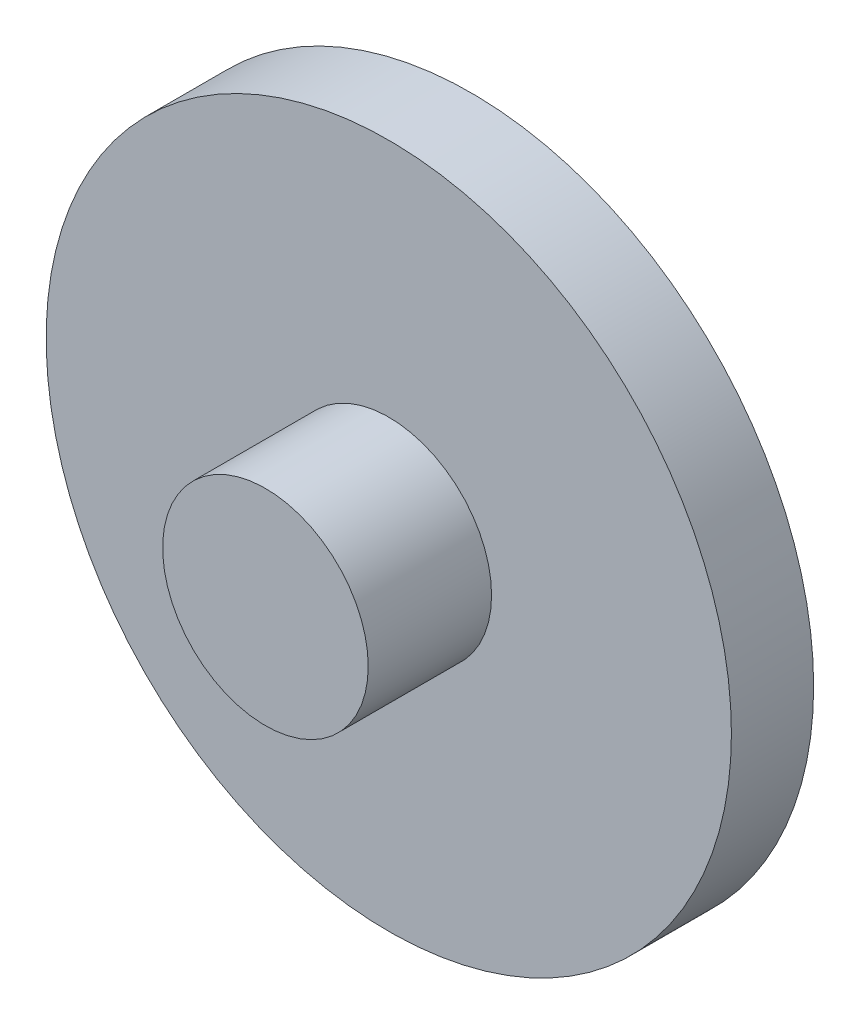
ISO-10303-21;
HEADER;
FILE_DESCRIPTION(('STEP AP214'),'2;1');
FILE_NAME('part.step','',(''),(''),'','','');
FILE_SCHEMA(('AUTOMOTIVE_DESIGN { 1 0 10303 214 1 1 1 1 }'));
ENDSEC;
DATA;
#1=APPLICATION_CONTEXT('core data for automotive mechanical design processes');
#2=APPLICATION_PROTOCOL_DEFINITION('international standard','automotive_design',2000,#1);
#3=PRODUCT_CONTEXT('',#1,'mechanical');
#4=PRODUCT('Part','Part','',(#3));
#5=PRODUCT_RELATED_PRODUCT_CATEGORY('part','',(#4));
#6=PRODUCT_DEFINITION_FORMATION('','',#4);
#7=PRODUCT_DEFINITION_CONTEXT('part definition',#1,'design');
#8=PRODUCT_DEFINITION('design','',#6,#7);
#9=PRODUCT_DEFINITION_SHAPE('','',#8);
#10=(LENGTH_UNIT() NAMED_UNIT(*) SI_UNIT(.MILLI.,.METRE.));
#11=(NAMED_UNIT(*) PLANE_ANGLE_UNIT() SI_UNIT($,.RADIAN.));
#12=(NAMED_UNIT(*) SI_UNIT($,.STERADIAN.) SOLID_ANGLE_UNIT());
#13=UNCERTAINTY_MEASURE_WITH_UNIT(LENGTH_MEASURE(1.E-05),#10,'distance_accuracy_value','');
#14=(GEOMETRIC_REPRESENTATION_CONTEXT(3) GLOBAL_UNCERTAINTY_ASSIGNED_CONTEXT((#13)) GLOBAL_UNIT_ASSIGNED_CONTEXT((#10,
#11,#12)) REPRESENTATION_CONTEXT('',''));
#15=CARTESIAN_POINT('',(0.,0.,0.));
#16=DIRECTION('',(0.,0.,1.));
#17=DIRECTION('',(1.,0.,0.));
#18=AXIS2_PLACEMENT_3D('',#15,#16,#17);
#19=CARTESIAN_POINT('',(75.,12.,12.));
#20=DIRECTION('',(0.,0.,-1.));
#21=DIRECTION('',(-1.,0.,0.));
#22=AXIS2_PLACEMENT_3D('',#19,#20,#21);
#23=CYLINDRICAL_SURFACE('',#22,50.);
#24=CARTESIAN_POINT('',(75.,12.,12.));
#25=DIRECTION('',(0.,0.,1.));
#26=DIRECTION('',(1.,0.,0.));
#27=AXIS2_PLACEMENT_3D('',#24,#25,#26);
#28=CIRCLE('',#27,50.);
#29=CARTESIAN_POINT('',(125.,12.,12.));
#30=VERTEX_POINT('',#29);
#31=EDGE_CURVE('E46',#30,#30,#28,.T.);
#32=ORIENTED_EDGE('',*,*,#31,.F.);
#33=EDGE_LOOP('',(#32));
#34=FACE_BOUND('',#33,.T.);
#35=CARTESIAN_POINT('',(75.,12.,0.));
#36=DIRECTION('',(0.,0.,1.));
#37=DIRECTION('',(1.,0.,0.));
#38=AXIS2_PLACEMENT_3D('',#35,#36,#37);
#39=CIRCLE('',#38,50.);
#40=CARTESIAN_POINT('',(125.,12.,0.));
#41=VERTEX_POINT('',#40);
#42=EDGE_CURVE('E42',#41,#41,#39,.T.);
#43=ORIENTED_EDGE('',*,*,#42,.T.);
#44=EDGE_LOOP('',(#43));
#45=FACE_BOUND('',#44,.T.);
#46=ADVANCED_FACE('F39',(#34,#45),#23,.T.);
#47=CARTESIAN_POINT('',(75.,12.,12.));
#48=DIRECTION('',(0.,0.,1.));
#49=DIRECTION('',(1.,0.,0.));
#50=AXIS2_PLACEMENT_3D('',#47,#48,#49);
#51=PLANE('',#50);
#52=CARTESIAN_POINT('',(75.,12.,12.));
#53=DIRECTION('',(0.,0.,1.));
#54=DIRECTION('',(1.,0.,0.));
#55=AXIS2_PLACEMENT_3D('',#52,#53,#54);
#56=CIRCLE('',#55,15.);
#57=CARTESIAN_POINT('',(90.,12.,12.));
#58=VERTEX_POINT('',#57);
#59=EDGE_CURVE('E10',#58,#58,#56,.T.);
#60=ORIENTED_EDGE('',*,*,#59,.F.);
#61=EDGE_LOOP('',(#60));
#62=FACE_BOUND('',#61,.T.);
#63=ORIENTED_EDGE('',*,*,#31,.T.);
#64=EDGE_LOOP('',(#63));
#65=FACE_BOUND('',#64,.T.);
#66=ADVANCED_FACE('F63',(#62,#65),#51,.T.);
#67=CARTESIAN_POINT('',(75.,12.,0.));
#68=DIRECTION('',(0.,0.,1.));
#69=DIRECTION('',(1.,0.,0.));
#70=AXIS2_PLACEMENT_3D('',#67,#68,#69);
#71=PLANE('',#70);
#72=ORIENTED_EDGE('',*,*,#42,.F.);
#73=EDGE_LOOP('',(#72));
#74=FACE_BOUND('',#73,.T.);
#75=ADVANCED_FACE('F60',(#74),#71,.F.);
#76=CARTESIAN_POINT('',(75.,12.,30.));
#77=DIRECTION('',(0.,0.,-1.));
#78=DIRECTION('',(-1.,0.,0.));
#79=AXIS2_PLACEMENT_3D('',#76,#77,#78);
#80=CYLINDRICAL_SURFACE('',#79,15.);
#81=CARTESIAN_POINT('',(75.,12.,30.));
#82=DIRECTION('',(0.,0.,1.));
#83=DIRECTION('',(1.,0.,0.));
#84=AXIS2_PLACEMENT_3D('',#81,#82,#83);
#85=CIRCLE('',#84,15.);
#86=CARTESIAN_POINT('',(90.,12.,30.));
#87=VERTEX_POINT('',#86);
#88=EDGE_CURVE('E52',#87,#87,#85,.T.);
#89=ORIENTED_EDGE('',*,*,#88,.F.);
#90=EDGE_LOOP('',(#89));
#91=FACE_BOUND('',#90,.T.);
#92=ORIENTED_EDGE('',*,*,#59,.T.);
#93=EDGE_LOOP('',(#92));
#94=FACE_BOUND('',#93,.T.);
#95=ADVANCED_FACE('F62',(#91,#94),#80,.T.);
#96=CARTESIAN_POINT('',(75.,12.,30.));
#97=DIRECTION('',(0.,0.,1.));
#98=DIRECTION('',(1.,0.,0.));
#99=AXIS2_PLACEMENT_3D('',#96,#97,#98);
#100=PLANE('',#99);
#101=ORIENTED_EDGE('',*,*,#88,.T.);
#102=EDGE_LOOP('',(#101));
#103=FACE_BOUND('',#102,.T.);
#104=ADVANCED_FACE('F69',(#103),#100,.T.);
#105=CLOSED_SHELL('',(#46,#66,#75,#95,#104));
#106=MANIFOLD_SOLID_BREP('B2',#105);
#107=ADVANCED_BREP_SHAPE_REPRESENTATION('',(#18,#106),#14);
#108=SHAPE_DEFINITION_REPRESENTATION(#9,#107);
ENDSEC;
END-ISO-10303-21;
